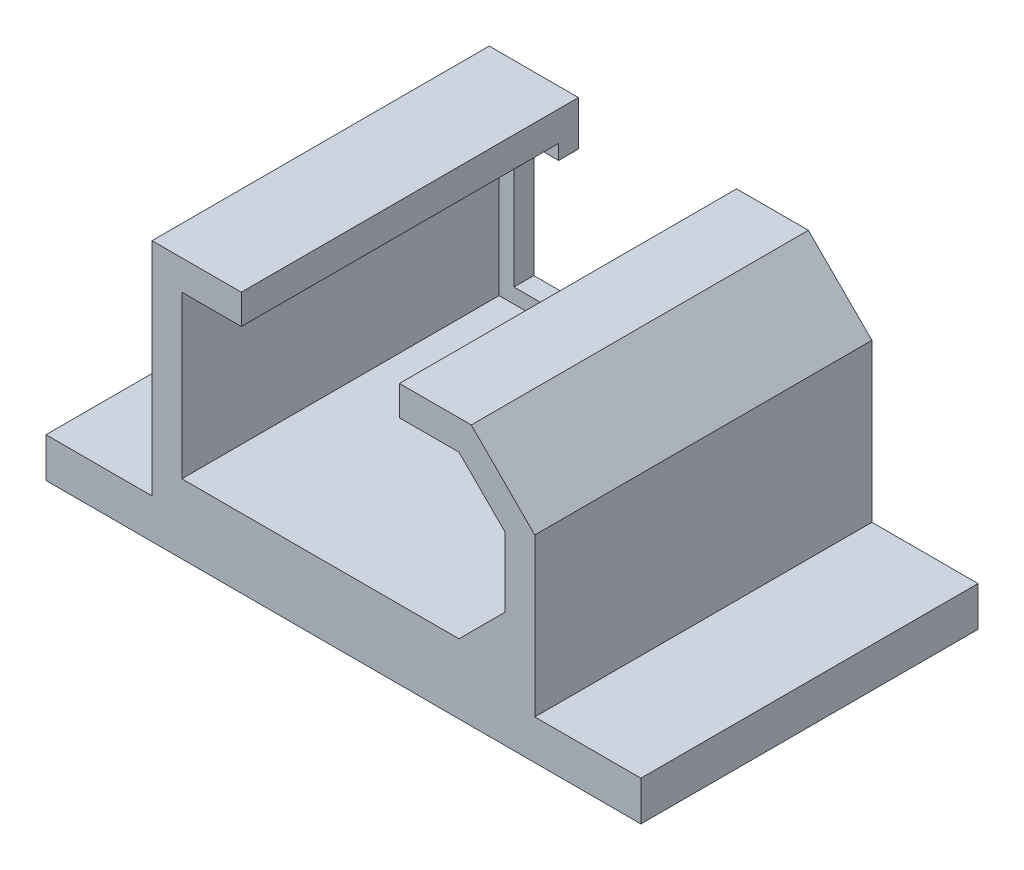
ISO-10303-21;
HEADER;
FILE_DESCRIPTION(('STEP AP214'),'2;1');
FILE_NAME('part.step','',(''),(''),'','','');
FILE_SCHEMA(('AUTOMOTIVE_DESIGN { 1 0 10303 214 1 1 1 1 }'));
ENDSEC;
DATA;
#1=APPLICATION_CONTEXT('core data for automotive mechanical design processes');
#2=APPLICATION_PROTOCOL_DEFINITION('international standard','automotive_design',2000,#1);
#3=PRODUCT_CONTEXT('',#1,'mechanical');
#4=PRODUCT('Part','Part','',(#3));
#5=PRODUCT_RELATED_PRODUCT_CATEGORY('part','',(#4));
#6=PRODUCT_DEFINITION_FORMATION('','',#4);
#7=PRODUCT_DEFINITION_CONTEXT('part definition',#1,'design');
#8=PRODUCT_DEFINITION('design','',#6,#7);
#9=PRODUCT_DEFINITION_SHAPE('','',#8);
#10=(LENGTH_UNIT() NAMED_UNIT(*) SI_UNIT(.MILLI.,.METRE.));
#11=(NAMED_UNIT(*) PLANE_ANGLE_UNIT() SI_UNIT($,.RADIAN.));
#12=(NAMED_UNIT(*) SI_UNIT($,.STERADIAN.) SOLID_ANGLE_UNIT());
#13=UNCERTAINTY_MEASURE_WITH_UNIT(LENGTH_MEASURE(1.E-05),#10,'distance_accuracy_value','');
#14=(GEOMETRIC_REPRESENTATION_CONTEXT(3) GLOBAL_UNCERTAINTY_ASSIGNED_CONTEXT((#13)) GLOBAL_UNIT_ASSIGNED_CONTEXT((#10,
#11,#12)) REPRESENTATION_CONTEXT('',''));
#15=CARTESIAN_POINT('',(0.,0.,0.));
#16=DIRECTION('',(0.,0.,1.));
#17=DIRECTION('',(1.,0.,0.));
#18=AXIS2_PLACEMENT_3D('',#15,#16,#17);
#19=CARTESIAN_POINT('',(24.65,0.,17.));
#20=DIRECTION('',(1.,0.,0.));
#21=DIRECTION('',(0.,0.,-1.));
#22=AXIS2_PLACEMENT_3D('',#19,#20,#21);
#23=PLANE('',#22);
#24=DIRECTION('',(0.,-1.,0.));
#25=VECTOR('',#24,1.);
#26=CARTESIAN_POINT('',(24.65,0.,0.));
#27=LINE('',#26,#25);
#28=CARTESIAN_POINT('',(24.65,9.94632034355964,0.));
#29=VERTEX_POINT('',#28);
#30=CARTESIAN_POINT('',(24.65,2.,0.));
#31=VERTEX_POINT('',#30);
#32=EDGE_CURVE('E177',#29,#31,#27,.T.);
#33=ORIENTED_EDGE('',*,*,#32,.F.);
#34=DIRECTION('',(0.,0.,-1.));
#35=VECTOR('',#34,1.);
#36=CARTESIAN_POINT('',(24.65,9.94632034355964,17.));
#37=LINE('',#36,#35);
#38=CARTESIAN_POINT('',(24.65,9.94632034355964,17.));
#39=VERTEX_POINT('',#38);
#40=EDGE_CURVE('E11',#39,#29,#37,.T.);
#41=ORIENTED_EDGE('',*,*,#40,.F.);
#42=DIRECTION('',(0.,-1.,0.));
#43=VECTOR('',#42,1.);
#44=CARTESIAN_POINT('',(24.65,0.,17.));
#45=LINE('',#44,#43);
#46=CARTESIAN_POINT('',(24.65,2.,17.));
#47=VERTEX_POINT('',#46);
#48=EDGE_CURVE('E208',#39,#47,#45,.T.);
#49=ORIENTED_EDGE('',*,*,#48,.T.);
#50=DIRECTION('',(0.,0.,-1.));
#51=VECTOR('',#50,1.);
#52=CARTESIAN_POINT('',(24.65,2.,17.));
#53=LINE('',#52,#51);
#54=EDGE_CURVE('E53',#47,#31,#53,.T.);
#55=ORIENTED_EDGE('',*,*,#54,.T.);
#56=EDGE_LOOP('',(#33,#41,#49,#55));
#57=FACE_BOUND('',#56,.T.);
#58=ADVANCED_FACE('F37',(#57),#23,.T.);
#59=CARTESIAN_POINT('',(17.2981601717798,17.2981601717798,17.));
#60=DIRECTION('',(-0.707106781186548,-0.707106781186547,0.));
#61=DIRECTION('',(0.707106781186547,-0.707106781186548,0.));
#62=AXIS2_PLACEMENT_3D('',#59,#60,#61);
#63=PLANE('',#62);
#64=DIRECTION('',(-0.707106781186547,0.707106781186548,0.));
#65=VECTOR('',#64,1.);
#66=CARTESIAN_POINT('',(17.2981601717798,17.2981601717798,0.));
#67=LINE('',#66,#65);
#68=CARTESIAN_POINT('',(21.4463203435596,13.15,0.));
#69=VERTEX_POINT('',#68);
#70=EDGE_CURVE('E179',#29,#69,#67,.T.);
#71=ORIENTED_EDGE('',*,*,#70,.T.);
#72=DIRECTION('',(0.,0.,-1.));
#73=VECTOR('',#72,1.);
#74=CARTESIAN_POINT('',(21.4463203435596,13.15,17.));
#75=LINE('',#74,#73);
#76=CARTESIAN_POINT('',(21.4463203435596,13.15,17.));
#77=VERTEX_POINT('',#76);
#78=EDGE_CURVE('E45',#77,#69,#75,.T.);
#79=ORIENTED_EDGE('',*,*,#78,.F.);
#80=DIRECTION('',(-0.707106781186547,0.707106781186548,0.));
#81=VECTOR('',#80,1.);
#82=CARTESIAN_POINT('',(17.2981601717798,17.2981601717798,17.));
#83=LINE('',#82,#81);
#84=EDGE_CURVE('E287',#39,#77,#83,.T.);
#85=ORIENTED_EDGE('',*,*,#84,.F.);
#86=ORIENTED_EDGE('',*,*,#40,.T.);
#87=EDGE_LOOP('',(#71,#79,#85,#86));
#88=FACE_BOUND('',#87,.T.);
#89=ADVANCED_FACE('F336',(#88),#63,.F.);
#90=CARTESIAN_POINT('',(0.,13.15,17.));
#91=DIRECTION('',(0.,-1.,0.));
#92=DIRECTION('',(0.,0.,-1.));
#93=AXIS2_PLACEMENT_3D('',#90,#91,#92);
#94=PLANE('',#93);
#95=DIRECTION('',(-1.,0.,0.));
#96=VECTOR('',#95,1.);
#97=CARTESIAN_POINT('',(0.,13.15,0.));
#98=LINE('',#97,#96);
#99=CARTESIAN_POINT('',(17.825,13.15,0.));
#100=VERTEX_POINT('',#99);
#101=EDGE_CURVE('E182',#69,#100,#98,.T.);
#102=ORIENTED_EDGE('',*,*,#101,.T.);
#103=DIRECTION('',(0.,0.,-1.));
#104=VECTOR('',#103,1.);
#105=CARTESIAN_POINT('',(17.825,13.15,17.));
#106=LINE('',#105,#104);
#107=CARTESIAN_POINT('',(17.825,13.15,17.));
#108=VERTEX_POINT('',#107);
#109=EDGE_CURVE('E244',#108,#100,#106,.T.);
#110=ORIENTED_EDGE('',*,*,#109,.F.);
#111=DIRECTION('',(-1.,0.,0.));
#112=VECTOR('',#111,1.);
#113=CARTESIAN_POINT('',(0.,13.15,17.));
#114=LINE('',#113,#112);
#115=EDGE_CURVE('E253',#77,#108,#114,.T.);
#116=ORIENTED_EDGE('',*,*,#115,.F.);
#117=ORIENTED_EDGE('',*,*,#78,.T.);
#118=EDGE_LOOP('',(#102,#110,#116,#117));
#119=FACE_BOUND('',#118,.T.);
#120=ADVANCED_FACE('F251',(#119),#94,.F.);
#121=CARTESIAN_POINT('',(17.825,0.,17.));
#122=DIRECTION('',(1.,0.,0.));
#123=DIRECTION('',(0.,0.,-1.));
#124=AXIS2_PLACEMENT_3D('',#121,#122,#123);
#125=PLANE('',#124);
#126=DIRECTION('',(0.,-1.,0.));
#127=VECTOR('',#126,1.);
#128=CARTESIAN_POINT('',(17.825,0.,0.));
#129=LINE('',#128,#127);
#130=CARTESIAN_POINT('',(17.825,10.9,0.));
#131=VERTEX_POINT('',#130);
#132=EDGE_CURVE('E184',#100,#131,#129,.T.);
#133=ORIENTED_EDGE('',*,*,#132,.T.);
#134=DIRECTION('',(0.,0.,-1.));
#135=VECTOR('',#134,1.);
#136=CARTESIAN_POINT('',(17.825,10.9,1.));
#137=LINE('',#136,#135);
#138=CARTESIAN_POINT('',(17.825,10.9,1.));
#139=VERTEX_POINT('',#138);
#140=EDGE_CURVE('E180',#139,#131,#137,.T.);
#141=ORIENTED_EDGE('',*,*,#140,.F.);
#142=DIRECTION('',(0.,-1.,0.));
#143=VECTOR('',#142,1.);
#144=CARTESIAN_POINT('',(17.825,0.,1.));
#145=LINE('',#144,#143);
#146=CARTESIAN_POINT('',(17.825,11.65,1.));
#147=VERTEX_POINT('',#146);
#148=EDGE_CURVE('E564',#147,#139,#145,.T.);
#149=ORIENTED_EDGE('',*,*,#148,.F.);
#150=DIRECTION('',(0.,0.,-1.));
#151=VECTOR('',#150,1.);
#152=CARTESIAN_POINT('',(17.825,11.65,17.));
#153=LINE('',#152,#151);
#154=CARTESIAN_POINT('',(17.825,11.65,17.));
#155=VERTEX_POINT('',#154);
#156=EDGE_CURVE('E241',#155,#147,#153,.T.);
#157=ORIENTED_EDGE('',*,*,#156,.F.);
#158=DIRECTION('',(0.,-1.,0.));
#159=VECTOR('',#158,1.);
#160=CARTESIAN_POINT('',(17.825,0.,17.));
#161=LINE('',#160,#159);
#162=EDGE_CURVE('E290',#108,#155,#161,.T.);
#163=ORIENTED_EDGE('',*,*,#162,.F.);
#164=ORIENTED_EDGE('',*,*,#109,.T.);
#165=EDGE_LOOP('',(#133,#141,#149,#157,#163,#164));
#166=FACE_BOUND('',#165,.T.);
#167=ADVANCED_FACE('F267',(#166),#125,.F.);
#168=CARTESIAN_POINT('',(0.,11.65,17.));
#169=DIRECTION('',(0.,1.,0.));
#170=DIRECTION('',(-1.,0.,0.));
#171=AXIS2_PLACEMENT_3D('',#168,#169,#170);
#172=PLANE('',#171);
#173=ORIENTED_EDGE('',*,*,#156,.T.);
#174=DIRECTION('',(1.,0.,0.));
#175=VECTOR('',#174,1.);
#176=CARTESIAN_POINT('',(0.,11.65,1.));
#177=LINE('',#176,#175);
#178=CARTESIAN_POINT('',(20.825,11.65,1.));
#179=VERTEX_POINT('',#178);
#180=EDGE_CURVE('E563',#147,#179,#177,.T.);
#181=ORIENTED_EDGE('',*,*,#180,.T.);
#182=DIRECTION('',(0.,0.,-1.));
#183=VECTOR('',#182,1.);
#184=CARTESIAN_POINT('',(20.825,11.65,17.));
#185=LINE('',#184,#183);
#186=CARTESIAN_POINT('',(20.825,11.65,17.));
#187=VERTEX_POINT('',#186);
#188=EDGE_CURVE('E238',#187,#179,#185,.T.);
#189=ORIENTED_EDGE('',*,*,#188,.F.);
#190=DIRECTION('',(1.,0.,0.));
#191=VECTOR('',#190,1.);
#192=CARTESIAN_POINT('',(0.,11.65,17.));
#193=LINE('',#192,#191);
#194=EDGE_CURVE('E292',#155,#187,#193,.T.);
#195=ORIENTED_EDGE('',*,*,#194,.F.);
#196=EDGE_LOOP('',(#173,#181,#189,#195));
#197=FACE_BOUND('',#196,.T.);
#198=ADVANCED_FACE('F347',(#197),#172,.F.);
#199=CARTESIAN_POINT('',(16.2375,16.2375,17.));
#200=DIRECTION('',(-0.707106781186548,-0.707106781186547,0.));
#201=DIRECTION('',(0.707106781186547,-0.707106781186548,0.));
#202=AXIS2_PLACEMENT_3D('',#199,#200,#201);
#203=PLANE('',#202);
#204=DIRECTION('',(-0.707106781186547,0.707106781186548,0.));
#205=VECTOR('',#204,1.);
#206=CARTESIAN_POINT('',(16.2375,16.2375,1.));
#207=LINE('',#206,#205);
#208=CARTESIAN_POINT('',(23.15,9.325,1.));
#209=VERTEX_POINT('',#208);
#210=EDGE_CURVE('E567',#209,#179,#207,.T.);
#211=ORIENTED_EDGE('',*,*,#210,.F.);
#212=DIRECTION('',(0.,0.,-1.));
#213=VECTOR('',#212,1.);
#214=CARTESIAN_POINT('',(23.15,9.325,17.));
#215=LINE('',#214,#213);
#216=CARTESIAN_POINT('',(23.15,9.325,17.));
#217=VERTEX_POINT('',#216);
#218=EDGE_CURVE('E235',#217,#209,#215,.T.);
#219=ORIENTED_EDGE('',*,*,#218,.F.);
#220=DIRECTION('',(-0.707106781186547,0.707106781186548,0.));
#221=VECTOR('',#220,1.);
#222=CARTESIAN_POINT('',(16.2375,16.2375,17.));
#223=LINE('',#222,#221);
#224=EDGE_CURVE('E294',#217,#187,#223,.T.);
#225=ORIENTED_EDGE('',*,*,#224,.T.);
#226=ORIENTED_EDGE('',*,*,#188,.T.);
#227=EDGE_LOOP('',(#211,#219,#225,#226));
#228=FACE_BOUND('',#227,.T.);
#229=ADVANCED_FACE('F350',(#228),#203,.T.);
#230=CARTESIAN_POINT('',(23.15,0.,17.));
#231=DIRECTION('',(-1.,0.,0.));
#232=DIRECTION('',(0.,0.,1.));
#233=AXIS2_PLACEMENT_3D('',#230,#231,#232);
#234=PLANE('',#233);
#235=DIRECTION('',(0.,1.,0.));
#236=VECTOR('',#235,1.);
#237=CARTESIAN_POINT('',(23.15,0.,1.));
#238=LINE('',#237,#236);
#239=CARTESIAN_POINT('',(23.15,5.825,1.));
#240=VERTEX_POINT('',#239);
#241=EDGE_CURVE('E610',#240,#209,#238,.T.);
#242=ORIENTED_EDGE('',*,*,#241,.F.);
#243=DIRECTION('',(0.,0.,-1.));
#244=VECTOR('',#243,1.);
#245=CARTESIAN_POINT('',(23.15,5.825,17.));
#246=LINE('',#245,#244);
#247=CARTESIAN_POINT('',(23.15,5.825,17.));
#248=VERTEX_POINT('',#247);
#249=EDGE_CURVE('E232',#248,#240,#246,.T.);
#250=ORIENTED_EDGE('',*,*,#249,.F.);
#251=DIRECTION('',(0.,1.,0.));
#252=VECTOR('',#251,1.);
#253=CARTESIAN_POINT('',(23.15,0.,17.));
#254=LINE('',#253,#252);
#255=EDGE_CURVE('E297',#248,#217,#254,.T.);
#256=ORIENTED_EDGE('',*,*,#255,.T.);
#257=ORIENTED_EDGE('',*,*,#218,.T.);
#258=EDGE_LOOP('',(#242,#250,#256,#257));
#259=FACE_BOUND('',#258,.T.);
#260=ADVANCED_FACE('F354',(#259),#234,.T.);
#261=CARTESIAN_POINT('',(8.66250000000004,-8.66250000000001,17.));
#262=DIRECTION('',(-0.707106781186549,0.707106781186546,0.));
#263=DIRECTION('',(-0.707106781186546,-0.707106781186549,0.));
#264=AXIS2_PLACEMENT_3D('',#261,#262,#263);
#265=PLANE('',#264);
#266=DIRECTION('',(0.707106781186546,0.707106781186549,0.));
#267=VECTOR('',#266,1.);
#268=CARTESIAN_POINT('',(8.66250000000004,-8.66250000000001,1.));
#269=LINE('',#268,#267);
#270=CARTESIAN_POINT('',(20.825,3.5,1.));
#271=VERTEX_POINT('',#270);
#272=EDGE_CURVE('E607',#271,#240,#269,.T.);
#273=ORIENTED_EDGE('',*,*,#272,.F.);
#274=DIRECTION('',(0.,0.,-1.));
#275=VECTOR('',#274,1.);
#276=CARTESIAN_POINT('',(20.825,3.5,17.));
#277=LINE('',#276,#275);
#278=CARTESIAN_POINT('',(20.825,3.5,17.));
#279=VERTEX_POINT('',#278);
#280=EDGE_CURVE('E229',#279,#271,#277,.T.);
#281=ORIENTED_EDGE('',*,*,#280,.F.);
#282=DIRECTION('',(0.707106781186546,0.707106781186549,0.));
#283=VECTOR('',#282,1.);
#284=CARTESIAN_POINT('',(8.66250000000004,-8.66250000000001,17.));
#285=LINE('',#284,#283);
#286=EDGE_CURVE('E300',#279,#248,#285,.T.);
#287=ORIENTED_EDGE('',*,*,#286,.T.);
#288=ORIENTED_EDGE('',*,*,#249,.T.);
#289=EDGE_LOOP('',(#273,#281,#287,#288));
#290=FACE_BOUND('',#289,.T.);
#291=ADVANCED_FACE('F358',(#290),#265,.T.);
#292=CARTESIAN_POINT('',(0.,3.5,17.));
#293=DIRECTION('',(0.,1.,0.));
#294=DIRECTION('',(-1.,0.,0.));
#295=AXIS2_PLACEMENT_3D('',#292,#293,#294);
#296=PLANE('',#295);
#297=DIRECTION('',(1.,0.,0.));
#298=VECTOR('',#297,1.);
#299=CARTESIAN_POINT('',(0.,3.5,1.));
#300=LINE('',#299,#298);
#301=CARTESIAN_POINT('',(6.85,3.5,1.));
#302=VERTEX_POINT('',#301);
#303=EDGE_CURVE('E604',#302,#271,#300,.T.);
#304=ORIENTED_EDGE('',*,*,#303,.F.);
#305=DIRECTION('',(0.,0.,-1.));
#306=VECTOR('',#305,1.);
#307=CARTESIAN_POINT('',(6.85,3.5,17.));
#308=LINE('',#307,#306);
#309=CARTESIAN_POINT('',(6.85,3.5,17.));
#310=VERTEX_POINT('',#309);
#311=EDGE_CURVE('E226',#310,#302,#308,.T.);
#312=ORIENTED_EDGE('',*,*,#311,.F.);
#313=DIRECTION('',(1.,0.,0.));
#314=VECTOR('',#313,1.);
#315=CARTESIAN_POINT('',(0.,3.5,17.));
#316=LINE('',#315,#314);
#317=EDGE_CURVE('E303',#310,#279,#316,.T.);
#318=ORIENTED_EDGE('',*,*,#317,.T.);
#319=ORIENTED_EDGE('',*,*,#280,.T.);
#320=EDGE_LOOP('',(#304,#312,#318,#319));
#321=FACE_BOUND('',#320,.T.);
#322=ADVANCED_FACE('F362',(#321),#296,.T.);
#323=CARTESIAN_POINT('',(6.85,0.,17.));
#324=DIRECTION('',(1.,0.,0.));
#325=DIRECTION('',(0.,0.,-1.));
#326=AXIS2_PLACEMENT_3D('',#323,#324,#325);
#327=PLANE('',#326);
#328=DIRECTION('',(0.,-1.,0.));
#329=VECTOR('',#328,1.);
#330=CARTESIAN_POINT('',(6.85,0.,1.));
#331=LINE('',#330,#329);
#332=CARTESIAN_POINT('',(6.85,11.65,1.));
#333=VERTEX_POINT('',#332);
#334=EDGE_CURVE('E601',#333,#302,#331,.T.);
#335=ORIENTED_EDGE('',*,*,#334,.F.);
#336=DIRECTION('',(0.,0.,-1.));
#337=VECTOR('',#336,1.);
#338=CARTESIAN_POINT('',(6.85,11.65,17.));
#339=LINE('',#338,#337);
#340=CARTESIAN_POINT('',(6.85,11.65,17.));
#341=VERTEX_POINT('',#340);
#342=EDGE_CURVE('E223',#341,#333,#339,.T.);
#343=ORIENTED_EDGE('',*,*,#342,.F.);
#344=DIRECTION('',(0.,-1.,0.));
#345=VECTOR('',#344,1.);
#346=CARTESIAN_POINT('',(6.85,0.,17.));
#347=LINE('',#346,#345);
#348=EDGE_CURVE('E306',#341,#310,#347,.T.);
#349=ORIENTED_EDGE('',*,*,#348,.T.);
#350=ORIENTED_EDGE('',*,*,#311,.T.);
#351=EDGE_LOOP('',(#335,#343,#349,#350));
#352=FACE_BOUND('',#351,.T.);
#353=ADVANCED_FACE('F366',(#352),#327,.T.);
#354=CARTESIAN_POINT('',(0.,11.65,17.));
#355=DIRECTION('',(0.,1.,0.));
#356=DIRECTION('',(0.,0.,1.));
#357=AXIS2_PLACEMENT_3D('',#354,#355,#356);
#358=PLANE('',#357);
#359=ORIENTED_EDGE('',*,*,#342,.T.);
#360=DIRECTION('',(1.,0.,0.));
#361=VECTOR('',#360,1.);
#362=CARTESIAN_POINT('',(0.,11.65,1.));
#363=LINE('',#362,#361);
#364=CARTESIAN_POINT('',(9.85,11.65,1.));
#365=VERTEX_POINT('',#364);
#366=EDGE_CURVE('E598',#333,#365,#363,.T.);
#367=ORIENTED_EDGE('',*,*,#366,.T.);
#368=DIRECTION('',(0.,0.,-1.));
#369=VECTOR('',#368,1.);
#370=CARTESIAN_POINT('',(9.85,11.65,17.));
#371=LINE('',#370,#369);
#372=CARTESIAN_POINT('',(9.85,11.65,17.));
#373=VERTEX_POINT('',#372);
#374=EDGE_CURVE('E220',#373,#365,#371,.T.);
#375=ORIENTED_EDGE('',*,*,#374,.F.);
#376=DIRECTION('',(1.,0.,0.));
#377=VECTOR('',#376,1.);
#378=CARTESIAN_POINT('',(0.,11.65,17.));
#379=LINE('',#378,#377);
#380=EDGE_CURVE('E309',#341,#373,#379,.T.);
#381=ORIENTED_EDGE('',*,*,#380,.F.);
#382=EDGE_LOOP('',(#359,#367,#375,#381));
#383=FACE_BOUND('',#382,.T.);
#384=ADVANCED_FACE('F370',(#383),#358,.F.);
#385=CARTESIAN_POINT('',(9.85,0.,17.));
#386=DIRECTION('',(1.,0.,0.));
#387=DIRECTION('',(0.,0.,-1.));
#388=AXIS2_PLACEMENT_3D('',#385,#386,#387);
#389=PLANE('',#388);
#390=DIRECTION('',(0.,-1.,0.));
#391=VECTOR('',#390,1.);
#392=CARTESIAN_POINT('',(9.85,0.,0.));
#393=LINE('',#392,#391);
#394=CARTESIAN_POINT('',(9.85,13.15,0.));
#395=VERTEX_POINT('',#394);
#396=CARTESIAN_POINT('',(9.85,10.9,0.));
#397=VERTEX_POINT('',#396);
#398=EDGE_CURVE('E187',#395,#397,#393,.T.);
#399=ORIENTED_EDGE('',*,*,#398,.F.);
#400=DIRECTION('',(0.,0.,-1.));
#401=VECTOR('',#400,1.);
#402=CARTESIAN_POINT('',(9.85,13.15,17.));
#403=LINE('',#402,#401);
#404=CARTESIAN_POINT('',(9.85,13.15,17.));
#405=VERTEX_POINT('',#404);
#406=EDGE_CURVE('E218',#405,#395,#403,.T.);
#407=ORIENTED_EDGE('',*,*,#406,.F.);
#408=DIRECTION('',(0.,-1.,0.));
#409=VECTOR('',#408,1.);
#410=CARTESIAN_POINT('',(9.85,0.,17.));
#411=LINE('',#410,#409);
#412=EDGE_CURVE('E311',#405,#373,#411,.T.);
#413=ORIENTED_EDGE('',*,*,#412,.T.);
#414=ORIENTED_EDGE('',*,*,#374,.T.);
#415=DIRECTION('',(0.,-1.,0.));
#416=VECTOR('',#415,1.);
#417=CARTESIAN_POINT('',(9.85,0.,1.));
#418=LINE('',#417,#416);
#419=CARTESIAN_POINT('',(9.85,10.9,1.));
#420=VERTEX_POINT('',#419);
#421=EDGE_CURVE('E595',#365,#420,#418,.T.);
#422=ORIENTED_EDGE('',*,*,#421,.T.);
#423=DIRECTION('',(0.,0.,-1.));
#424=VECTOR('',#423,1.);
#425=CARTESIAN_POINT('',(9.85,10.9,1.));
#426=LINE('',#425,#424);
#427=EDGE_CURVE('E613',#420,#397,#426,.T.);
#428=ORIENTED_EDGE('',*,*,#427,.T.);
#429=EDGE_LOOP('',(#399,#407,#413,#414,#422,#428));
#430=FACE_BOUND('',#429,.T.);
#431=ADVANCED_FACE('F374',(#430),#389,.T.);
#432=CARTESIAN_POINT('',(0.,13.15,17.));
#433=DIRECTION('',(0.,1.,0.));
#434=DIRECTION('',(0.,0.,1.));
#435=AXIS2_PLACEMENT_3D('',#432,#433,#434);
#436=PLANE('',#435);
#437=DIRECTION('',(1.,0.,0.));
#438=VECTOR('',#437,1.);
#439=CARTESIAN_POINT('',(0.,13.15,0.));
#440=LINE('',#439,#438);
#441=CARTESIAN_POINT('',(5.35,13.15,0.));
#442=VERTEX_POINT('',#441);
#443=EDGE_CURVE('E190',#442,#395,#440,.T.);
#444=ORIENTED_EDGE('',*,*,#443,.F.);
#445=DIRECTION('',(0.,0.,-1.));
#446=VECTOR('',#445,1.);
#447=CARTESIAN_POINT('',(5.35,13.15,17.));
#448=LINE('',#447,#446);
#449=CARTESIAN_POINT('',(5.35,13.15,17.));
#450=VERTEX_POINT('',#449);
#451=EDGE_CURVE('E216',#450,#442,#448,.T.);
#452=ORIENTED_EDGE('',*,*,#451,.F.);
#453=DIRECTION('',(1.,0.,0.));
#454=VECTOR('',#453,1.);
#455=CARTESIAN_POINT('',(0.,13.15,17.));
#456=LINE('',#455,#454);
#457=EDGE_CURVE('E314',#450,#405,#456,.T.);
#458=ORIENTED_EDGE('',*,*,#457,.T.);
#459=ORIENTED_EDGE('',*,*,#406,.T.);
#460=EDGE_LOOP('',(#444,#452,#458,#459));
#461=FACE_BOUND('',#460,.T.);
#462=ADVANCED_FACE('F378',(#461),#436,.T.);
#463=CARTESIAN_POINT('',(5.35,0.,17.));
#464=DIRECTION('',(1.,0.,0.));
#465=DIRECTION('',(0.,0.,-1.));
#466=AXIS2_PLACEMENT_3D('',#463,#464,#465);
#467=PLANE('',#466);
#468=DIRECTION('',(0.,-1.,0.));
#469=VECTOR('',#468,1.);
#470=CARTESIAN_POINT('',(5.35,0.,0.));
#471=LINE('',#470,#469);
#472=CARTESIAN_POINT('',(5.35,2.,0.));
#473=VERTEX_POINT('',#472);
#474=EDGE_CURVE('E193',#442,#473,#471,.T.);
#475=ORIENTED_EDGE('',*,*,#474,.T.);
#476=DIRECTION('',(0.,0.,-1.));
#477=VECTOR('',#476,1.);
#478=CARTESIAN_POINT('',(5.35,2.,17.));
#479=LINE('',#478,#477);
#480=CARTESIAN_POINT('',(5.35,2.,17.));
#481=VERTEX_POINT('',#480);
#482=EDGE_CURVE('E214',#481,#473,#479,.T.);
#483=ORIENTED_EDGE('',*,*,#482,.F.);
#484=DIRECTION('',(0.,-1.,0.));
#485=VECTOR('',#484,1.);
#486=CARTESIAN_POINT('',(5.35,0.,17.));
#487=LINE('',#486,#485);
#488=EDGE_CURVE('E317',#450,#481,#487,.T.);
#489=ORIENTED_EDGE('',*,*,#488,.F.);
#490=ORIENTED_EDGE('',*,*,#451,.T.);
#491=EDGE_LOOP('',(#475,#483,#489,#490));
#492=FACE_BOUND('',#491,.T.);
#493=ADVANCED_FACE('F382',(#492),#467,.F.);
#494=CARTESIAN_POINT('',(0.,2.,17.));
#495=DIRECTION('',(0.,1.,0.));
#496=DIRECTION('',(-1.,0.,0.));
#497=AXIS2_PLACEMENT_3D('',#494,#495,#496);
#498=PLANE('',#497);
#499=DIRECTION('',(1.,0.,0.));
#500=VECTOR('',#499,1.);
#501=CARTESIAN_POINT('',(0.,2.,0.));
#502=LINE('',#501,#500);
#503=CARTESIAN_POINT('',(0.,2.,0.));
#504=VERTEX_POINT('',#503);
#505=EDGE_CURVE('E196',#504,#473,#502,.T.);
#506=ORIENTED_EDGE('',*,*,#505,.F.);
#507=DIRECTION('',(0.,0.,-1.));
#508=VECTOR('',#507,1.);
#509=CARTESIAN_POINT('',(0.,2.,17.));
#510=LINE('',#509,#508);
#511=CARTESIAN_POINT('',(0.,2.,17.));
#512=VERTEX_POINT('',#511);
#513=EDGE_CURVE('E212',#512,#504,#510,.T.);
#514=ORIENTED_EDGE('',*,*,#513,.F.);
#515=DIRECTION('',(1.,0.,0.));
#516=VECTOR('',#515,1.);
#517=CARTESIAN_POINT('',(0.,2.,17.));
#518=LINE('',#517,#516);
#519=EDGE_CURVE('E319',#512,#481,#518,.T.);
#520=ORIENTED_EDGE('',*,*,#519,.T.);
#521=ORIENTED_EDGE('',*,*,#482,.T.);
#522=EDGE_LOOP('',(#506,#514,#520,#521));
#523=FACE_BOUND('',#522,.T.);
#524=ADVANCED_FACE('F386',(#523),#498,.T.);
#525=CARTESIAN_POINT('',(0.,0.,17.));
#526=DIRECTION('',(-1.,0.,0.));
#527=DIRECTION('',(0.,0.,1.));
#528=AXIS2_PLACEMENT_3D('',#525,#526,#527);
#529=PLANE('',#528);
#530=DIRECTION('',(0.,1.,0.));
#531=VECTOR('',#530,1.);
#532=CARTESIAN_POINT('',(0.,0.,0.));
#533=LINE('',#532,#531);
#534=CARTESIAN_POINT('',(0.,0.,0.));
#535=VERTEX_POINT('',#534);
#536=EDGE_CURVE('E199',#535,#504,#533,.T.);
#537=ORIENTED_EDGE('',*,*,#536,.F.);
#538=DIRECTION('',(0.,0.,-1.));
#539=VECTOR('',#538,1.);
#540=CARTESIAN_POINT('',(0.,0.,17.));
#541=LINE('',#540,#539);
#542=CARTESIAN_POINT('',(0.,0.,17.));
#543=VERTEX_POINT('',#542);
#544=EDGE_CURVE('E158',#543,#535,#541,.T.);
#545=ORIENTED_EDGE('',*,*,#544,.F.);
#546=DIRECTION('',(0.,1.,0.));
#547=VECTOR('',#546,1.);
#548=CARTESIAN_POINT('',(0.,0.,17.));
#549=LINE('',#548,#547);
#550=EDGE_CURVE('E169',#543,#512,#549,.T.);
#551=ORIENTED_EDGE('',*,*,#550,.T.);
#552=ORIENTED_EDGE('',*,*,#513,.T.);
#553=EDGE_LOOP('',(#537,#545,#551,#552));
#554=FACE_BOUND('',#553,.T.);
#555=ADVANCED_FACE('F323',(#554),#529,.T.);
#556=CARTESIAN_POINT('',(0.,0.,17.));
#557=DIRECTION('',(0.,-1.,0.));
#558=DIRECTION('',(0.,0.,-1.));
#559=AXIS2_PLACEMENT_3D('',#556,#557,#558);
#560=PLANE('',#559);
#561=DIRECTION('',(-1.,0.,0.));
#562=VECTOR('',#561,1.);
#563=CARTESIAN_POINT('',(0.,0.,0.));
#564=LINE('',#563,#562);
#565=CARTESIAN_POINT('',(30.,0.,0.));
#566=VERTEX_POINT('',#565);
#567=EDGE_CURVE('E154',#566,#535,#564,.T.);
#568=ORIENTED_EDGE('',*,*,#567,.F.);
#569=DIRECTION('',(0.,0.,-1.));
#570=VECTOR('',#569,1.);
#571=CARTESIAN_POINT('',(30.,0.,17.));
#572=LINE('',#571,#570);
#573=CARTESIAN_POINT('',(30.,0.,17.));
#574=VERTEX_POINT('',#573);
#575=EDGE_CURVE('E149',#574,#566,#572,.T.);
#576=ORIENTED_EDGE('',*,*,#575,.F.);
#577=DIRECTION('',(-1.,0.,0.));
#578=VECTOR('',#577,1.);
#579=CARTESIAN_POINT('',(0.,0.,17.));
#580=LINE('',#579,#578);
#581=EDGE_CURVE('E152',#574,#543,#580,.T.);
#582=ORIENTED_EDGE('',*,*,#581,.T.);
#583=ORIENTED_EDGE('',*,*,#544,.T.);
#584=EDGE_LOOP('',(#568,#576,#582,#583));
#585=FACE_BOUND('',#584,.T.);
#586=ADVANCED_FACE('F151',(#585),#560,.T.);
#587=CARTESIAN_POINT('',(30.,0.,17.));
#588=DIRECTION('',(1.,0.,0.));
#589=DIRECTION('',(0.,0.,-1.));
#590=AXIS2_PLACEMENT_3D('',#587,#588,#589);
#591=PLANE('',#590);
#592=DIRECTION('',(0.,-1.,0.));
#593=VECTOR('',#592,1.);
#594=CARTESIAN_POINT('',(30.,0.,0.));
#595=LINE('',#594,#593);
#596=CARTESIAN_POINT('',(30.,2.,0.));
#597=VERTEX_POINT('',#596);
#598=EDGE_CURVE('E203',#597,#566,#595,.T.);
#599=ORIENTED_EDGE('',*,*,#598,.F.);
#600=DIRECTION('',(0.,0.,-1.));
#601=VECTOR('',#600,1.);
#602=CARTESIAN_POINT('',(30.,2.,17.));
#603=LINE('',#602,#601);
#604=CARTESIAN_POINT('',(30.,2.,17.));
#605=VERTEX_POINT('',#604);
#606=EDGE_CURVE('E88',#605,#597,#603,.T.);
#607=ORIENTED_EDGE('',*,*,#606,.F.);
#608=DIRECTION('',(0.,-1.,0.));
#609=VECTOR('',#608,1.);
#610=CARTESIAN_POINT('',(30.,0.,17.));
#611=LINE('',#610,#609);
#612=EDGE_CURVE('E166',#605,#574,#611,.T.);
#613=ORIENTED_EDGE('',*,*,#612,.T.);
#614=ORIENTED_EDGE('',*,*,#575,.T.);
#615=EDGE_LOOP('',(#599,#607,#613,#614));
#616=FACE_BOUND('',#615,.T.);
#617=ADVANCED_FACE('F171',(#616),#591,.T.);
#618=CARTESIAN_POINT('',(0.,2.,17.));
#619=DIRECTION('',(0.,1.,0.));
#620=DIRECTION('',(0.,0.,1.));
#621=AXIS2_PLACEMENT_3D('',#618,#619,#620);
#622=PLANE('',#621);
#623=DIRECTION('',(1.,0.,0.));
#624=VECTOR('',#623,1.);
#625=CARTESIAN_POINT('',(0.,2.,0.));
#626=LINE('',#625,#624);
#627=EDGE_CURVE('E205',#31,#597,#626,.T.);
#628=ORIENTED_EDGE('',*,*,#627,.F.);
#629=ORIENTED_EDGE('',*,*,#54,.F.);
#630=DIRECTION('',(1.,0.,0.));
#631=VECTOR('',#630,1.);
#632=CARTESIAN_POINT('',(0.,2.,17.));
#633=LINE('',#632,#631);
#634=EDGE_CURVE('E172',#47,#605,#633,.T.);
#635=ORIENTED_EDGE('',*,*,#634,.T.);
#636=ORIENTED_EDGE('',*,*,#606,.T.);
#637=EDGE_LOOP('',(#628,#629,#635,#636));
#638=FACE_BOUND('',#637,.T.);
#639=ADVANCED_FACE('F325',(#638),#622,.T.);
#640=CARTESIAN_POINT('',(0.,0.,17.));
#641=DIRECTION('',(0.,0.,1.));
#642=DIRECTION('',(1.,0.,0.));
#643=AXIS2_PLACEMENT_3D('',#640,#641,#642);
#644=PLANE('',#643);
#645=ORIENTED_EDGE('',*,*,#48,.F.);
#646=ORIENTED_EDGE('',*,*,#84,.T.);
#647=ORIENTED_EDGE('',*,*,#115,.T.);
#648=ORIENTED_EDGE('',*,*,#162,.T.);
#649=ORIENTED_EDGE('',*,*,#194,.T.);
#650=ORIENTED_EDGE('',*,*,#224,.F.);
#651=ORIENTED_EDGE('',*,*,#255,.F.);
#652=ORIENTED_EDGE('',*,*,#286,.F.);
#653=ORIENTED_EDGE('',*,*,#317,.F.);
#654=ORIENTED_EDGE('',*,*,#348,.F.);
#655=ORIENTED_EDGE('',*,*,#380,.T.);
#656=ORIENTED_EDGE('',*,*,#412,.F.);
#657=ORIENTED_EDGE('',*,*,#457,.F.);
#658=ORIENTED_EDGE('',*,*,#488,.T.);
#659=ORIENTED_EDGE('',*,*,#519,.F.);
#660=ORIENTED_EDGE('',*,*,#550,.F.);
#661=ORIENTED_EDGE('',*,*,#581,.F.);
#662=ORIENTED_EDGE('',*,*,#612,.F.);
#663=ORIENTED_EDGE('',*,*,#634,.F.);
#664=EDGE_LOOP('',(#645,#646,#647,#648,#649,#650,#651,#652,#653,#654,#655,#656,#657,#658,#659,
#660,#661,#662,#663));
#665=FACE_BOUND('',#664,.T.);
#666=ADVANCED_FACE('F164',(#665),#644,.T.);
#667=CARTESIAN_POINT('',(0.,0.,0.));
#668=DIRECTION('',(0.,0.,1.));
#669=DIRECTION('',(1.,0.,0.));
#670=AXIS2_PLACEMENT_3D('',#667,#668,#669);
#671=PLANE('',#670);
#672=ORIENTED_EDGE('',*,*,#398,.T.);
#673=DIRECTION('',(1.,0.,0.));
#674=VECTOR('',#673,1.);
#675=CARTESIAN_POINT('',(0.,10.9,0.));
#676=LINE('',#675,#674);
#677=CARTESIAN_POINT('',(7.6,10.9,0.));
#678=VERTEX_POINT('',#677);
#679=EDGE_CURVE('E570',#678,#397,#676,.T.);
#680=ORIENTED_EDGE('',*,*,#679,.F.);
#681=DIRECTION('',(0.,-1.,0.));
#682=VECTOR('',#681,1.);
#683=CARTESIAN_POINT('',(7.6,0.,0.));
#684=LINE('',#683,#682);
#685=CARTESIAN_POINT('',(7.6,4.25,0.));
#686=VERTEX_POINT('',#685);
#687=EDGE_CURVE('E626',#678,#686,#684,.T.);
#688=ORIENTED_EDGE('',*,*,#687,.T.);
#689=DIRECTION('',(1.,0.,0.));
#690=VECTOR('',#689,1.);
#691=CARTESIAN_POINT('',(0.,4.25,0.));
#692=LINE('',#691,#690);
#693=CARTESIAN_POINT('',(20.5143398282202,4.25,0.));
#694=VERTEX_POINT('',#693);
#695=EDGE_CURVE('E623',#686,#694,#692,.T.);
#696=ORIENTED_EDGE('',*,*,#695,.T.);
#697=DIRECTION('',(0.707106781186546,0.707106781186549,0.));
#698=VECTOR('',#697,1.);
#699=CARTESIAN_POINT('',(8.13216991411014,-8.1321699141101,0.));
#700=LINE('',#699,#698);
#701=CARTESIAN_POINT('',(22.4,6.13566017177982,0.));
#702=VERTEX_POINT('',#701);
#703=EDGE_CURVE('E620',#694,#702,#700,.T.);
#704=ORIENTED_EDGE('',*,*,#703,.T.);
#705=DIRECTION('',(0.,1.,0.));
#706=VECTOR('',#705,1.);
#707=CARTESIAN_POINT('',(22.4,0.,0.));
#708=LINE('',#707,#706);
#709=CARTESIAN_POINT('',(22.4,9.01433982822018,0.));
#710=VERTEX_POINT('',#709);
#711=EDGE_CURVE('E617',#702,#710,#708,.T.);
#712=ORIENTED_EDGE('',*,*,#711,.T.);
#713=DIRECTION('',(-0.707106781186547,0.707106781186548,0.));
#714=VECTOR('',#713,1.);
#715=CARTESIAN_POINT('',(15.7071699141101,15.7071699141101,0.));
#716=LINE('',#715,#714);
#717=CARTESIAN_POINT('',(20.5143398282202,10.9,0.));
#718=VERTEX_POINT('',#717);
#719=EDGE_CURVE('E615',#710,#718,#716,.T.);
#720=ORIENTED_EDGE('',*,*,#719,.T.);
#721=DIRECTION('',(1.,0.,0.));
#722=VECTOR('',#721,1.);
#723=CARTESIAN_POINT('',(0.,10.9,0.));
#724=LINE('',#723,#722);
#725=EDGE_CURVE('E263',#131,#718,#724,.T.);
#726=ORIENTED_EDGE('',*,*,#725,.F.);
#727=ORIENTED_EDGE('',*,*,#132,.F.);
#728=ORIENTED_EDGE('',*,*,#101,.F.);
#729=ORIENTED_EDGE('',*,*,#70,.F.);
#730=ORIENTED_EDGE('',*,*,#32,.T.);
#731=ORIENTED_EDGE('',*,*,#627,.T.);
#732=ORIENTED_EDGE('',*,*,#598,.T.);
#733=ORIENTED_EDGE('',*,*,#567,.T.);
#734=ORIENTED_EDGE('',*,*,#536,.T.);
#735=ORIENTED_EDGE('',*,*,#505,.T.);
#736=ORIENTED_EDGE('',*,*,#474,.F.);
#737=ORIENTED_EDGE('',*,*,#443,.T.);
#738=EDGE_LOOP('',(#672,#680,#688,#696,#704,#712,#720,#726,#727,#728,#729,#730,#731,#732,#733,
#734,#735,#736,#737));
#739=FACE_BOUND('',#738,.T.);
#740=ADVANCED_FACE('F258',(#739),#671,.F.);
#741=CARTESIAN_POINT('',(0.,10.9,1.));
#742=DIRECTION('',(0.,1.,0.));
#743=DIRECTION('',(0.,0.,1.));
#744=AXIS2_PLACEMENT_3D('',#741,#742,#743);
#745=PLANE('',#744);
#746=ORIENTED_EDGE('',*,*,#725,.T.);
#747=DIRECTION('',(0.,0.,-1.));
#748=VECTOR('',#747,1.);
#749=CARTESIAN_POINT('',(20.5143398282202,10.9,1.));
#750=LINE('',#749,#748);
#751=CARTESIAN_POINT('',(20.5143398282202,10.9,1.));
#752=VERTEX_POINT('',#751);
#753=EDGE_CURVE('E279',#752,#718,#750,.T.);
#754=ORIENTED_EDGE('',*,*,#753,.F.);
#755=DIRECTION('',(1.,0.,0.));
#756=VECTOR('',#755,1.);
#757=CARTESIAN_POINT('',(0.,10.9,1.));
#758=LINE('',#757,#756);
#759=EDGE_CURVE('E278',#139,#752,#758,.T.);
#760=ORIENTED_EDGE('',*,*,#759,.F.);
#761=ORIENTED_EDGE('',*,*,#140,.T.);
#762=EDGE_LOOP('',(#746,#754,#760,#761));
#763=FACE_BOUND('',#762,.T.);
#764=ADVANCED_FACE('F275',(#763),#745,.F.);
#765=CARTESIAN_POINT('',(15.7071699141101,15.7071699141101,1.));
#766=DIRECTION('',(-0.707106781186548,-0.707106781186547,0.));
#767=DIRECTION('',(0.707106781186547,-0.707106781186548,0.));
#768=AXIS2_PLACEMENT_3D('',#765,#766,#767);
#769=PLANE('',#768);
#770=ORIENTED_EDGE('',*,*,#719,.F.);
#771=DIRECTION('',(0.,0.,-1.));
#772=VECTOR('',#771,1.);
#773=CARTESIAN_POINT('',(22.4,9.01433982822018,1.));
#774=LINE('',#773,#772);
#775=CARTESIAN_POINT('',(22.4,9.01433982822018,1.));
#776=VERTEX_POINT('',#775);
#777=EDGE_CURVE('E282',#776,#710,#774,.T.);
#778=ORIENTED_EDGE('',*,*,#777,.F.);
#779=DIRECTION('',(-0.707106781186547,0.707106781186548,0.));
#780=VECTOR('',#779,1.);
#781=CARTESIAN_POINT('',(15.7071699141101,15.7071699141101,1.));
#782=LINE('',#781,#780);
#783=EDGE_CURVE('E575',#776,#752,#782,.T.);
#784=ORIENTED_EDGE('',*,*,#783,.T.);
#785=ORIENTED_EDGE('',*,*,#753,.T.);
#786=EDGE_LOOP('',(#770,#778,#784,#785));
#787=FACE_BOUND('',#786,.T.);
#788=ADVANCED_FACE('F485',(#787),#769,.T.);
#789=CARTESIAN_POINT('',(22.4,0.,1.));
#790=DIRECTION('',(-1.,0.,0.));
#791=DIRECTION('',(0.,0.,1.));
#792=AXIS2_PLACEMENT_3D('',#789,#790,#791);
#793=PLANE('',#792);
#794=ORIENTED_EDGE('',*,*,#711,.F.);
#795=DIRECTION('',(0.,0.,-1.));
#796=VECTOR('',#795,1.);
#797=CARTESIAN_POINT('',(22.4,6.13566017177982,1.));
#798=LINE('',#797,#796);
#799=CARTESIAN_POINT('',(22.4,6.13566017177982,1.));
#800=VERTEX_POINT('',#799);
#801=EDGE_CURVE('E642',#800,#702,#798,.T.);
#802=ORIENTED_EDGE('',*,*,#801,.F.);
#803=DIRECTION('',(0.,1.,0.));
#804=VECTOR('',#803,1.);
#805=CARTESIAN_POINT('',(22.4,0.,1.));
#806=LINE('',#805,#804);
#807=EDGE_CURVE('E580',#800,#776,#806,.T.);
#808=ORIENTED_EDGE('',*,*,#807,.T.);
#809=ORIENTED_EDGE('',*,*,#777,.T.);
#810=EDGE_LOOP('',(#794,#802,#808,#809));
#811=FACE_BOUND('',#810,.T.);
#812=ADVANCED_FACE('F494',(#811),#793,.T.);
#813=CARTESIAN_POINT('',(8.13216991411014,-8.1321699141101,1.));
#814=DIRECTION('',(-0.707106781186549,0.707106781186546,0.));
#815=DIRECTION('',(-0.707106781186546,-0.707106781186549,0.));
#816=AXIS2_PLACEMENT_3D('',#813,#814,#815);
#817=PLANE('',#816);
#818=ORIENTED_EDGE('',*,*,#703,.F.);
#819=DIRECTION('',(0.,0.,-1.));
#820=VECTOR('',#819,1.);
#821=CARTESIAN_POINT('',(20.5143398282202,4.25,1.));
#822=LINE('',#821,#820);
#823=CARTESIAN_POINT('',(20.5143398282202,4.25,1.));
#824=VERTEX_POINT('',#823);
#825=EDGE_CURVE('E639',#824,#694,#822,.T.);
#826=ORIENTED_EDGE('',*,*,#825,.F.);
#827=DIRECTION('',(0.707106781186546,0.707106781186549,0.));
#828=VECTOR('',#827,1.);
#829=CARTESIAN_POINT('',(8.13216991411014,-8.1321699141101,1.));
#830=LINE('',#829,#828);
#831=EDGE_CURVE('E583',#824,#800,#830,.T.);
#832=ORIENTED_EDGE('',*,*,#831,.T.);
#833=ORIENTED_EDGE('',*,*,#801,.T.);
#834=EDGE_LOOP('',(#818,#826,#832,#833));
#835=FACE_BOUND('',#834,.T.);
#836=ADVANCED_FACE('F504',(#835),#817,.T.);
#837=CARTESIAN_POINT('',(0.,4.25,1.));
#838=DIRECTION('',(0.,1.,0.));
#839=DIRECTION('',(-1.,0.,0.));
#840=AXIS2_PLACEMENT_3D('',#837,#838,#839);
#841=PLANE('',#840);
#842=ORIENTED_EDGE('',*,*,#695,.F.);
#843=DIRECTION('',(0.,0.,-1.));
#844=VECTOR('',#843,1.);
#845=CARTESIAN_POINT('',(7.6,4.25,1.));
#846=LINE('',#845,#844);
#847=CARTESIAN_POINT('',(7.6,4.25,1.));
#848=VERTEX_POINT('',#847);
#849=EDGE_CURVE('E636',#848,#686,#846,.T.);
#850=ORIENTED_EDGE('',*,*,#849,.F.);
#851=DIRECTION('',(1.,0.,0.));
#852=VECTOR('',#851,1.);
#853=CARTESIAN_POINT('',(0.,4.25,1.));
#854=LINE('',#853,#852);
#855=EDGE_CURVE('E586',#848,#824,#854,.T.);
#856=ORIENTED_EDGE('',*,*,#855,.T.);
#857=ORIENTED_EDGE('',*,*,#825,.T.);
#858=EDGE_LOOP('',(#842,#850,#856,#857));
#859=FACE_BOUND('',#858,.T.);
#860=ADVANCED_FACE('F514',(#859),#841,.T.);
#861=CARTESIAN_POINT('',(7.6,0.,1.));
#862=DIRECTION('',(1.,0.,0.));
#863=DIRECTION('',(0.,0.,-1.));
#864=AXIS2_PLACEMENT_3D('',#861,#862,#863);
#865=PLANE('',#864);
#866=ORIENTED_EDGE('',*,*,#687,.F.);
#867=DIRECTION('',(0.,0.,-1.));
#868=VECTOR('',#867,1.);
#869=CARTESIAN_POINT('',(7.6,10.9,1.));
#870=LINE('',#869,#868);
#871=CARTESIAN_POINT('',(7.6,10.9,1.));
#872=VERTEX_POINT('',#871);
#873=EDGE_CURVE('E633',#872,#678,#870,.T.);
#874=ORIENTED_EDGE('',*,*,#873,.F.);
#875=DIRECTION('',(0.,-1.,0.));
#876=VECTOR('',#875,1.);
#877=CARTESIAN_POINT('',(7.6,0.,1.));
#878=LINE('',#877,#876);
#879=EDGE_CURVE('E589',#872,#848,#878,.T.);
#880=ORIENTED_EDGE('',*,*,#879,.T.);
#881=ORIENTED_EDGE('',*,*,#849,.T.);
#882=EDGE_LOOP('',(#866,#874,#880,#881));
#883=FACE_BOUND('',#882,.T.);
#884=ADVANCED_FACE('F524',(#883),#865,.T.);
#885=CARTESIAN_POINT('',(0.,10.9,1.));
#886=DIRECTION('',(0.,1.,0.));
#887=DIRECTION('',(0.,0.,1.));
#888=AXIS2_PLACEMENT_3D('',#885,#886,#887);
#889=PLANE('',#888);
#890=ORIENTED_EDGE('',*,*,#679,.T.);
#891=ORIENTED_EDGE('',*,*,#427,.F.);
#892=DIRECTION('',(1.,0.,0.));
#893=VECTOR('',#892,1.);
#894=CARTESIAN_POINT('',(0.,10.9,1.));
#895=LINE('',#894,#893);
#896=EDGE_CURVE('E592',#872,#420,#895,.T.);
#897=ORIENTED_EDGE('',*,*,#896,.F.);
#898=ORIENTED_EDGE('',*,*,#873,.T.);
#899=EDGE_LOOP('',(#890,#891,#897,#898));
#900=FACE_BOUND('',#899,.T.);
#901=ADVANCED_FACE('F534',(#900),#889,.F.);
#902=CARTESIAN_POINT('',(0.,0.,1.));
#903=DIRECTION('',(0.,0.,1.));
#904=DIRECTION('',(1.,0.,0.));
#905=AXIS2_PLACEMENT_3D('',#902,#903,#904);
#906=PLANE('',#905);
#907=ORIENTED_EDGE('',*,*,#180,.F.);
#908=ORIENTED_EDGE('',*,*,#148,.T.);
#909=ORIENTED_EDGE('',*,*,#759,.T.);
#910=ORIENTED_EDGE('',*,*,#783,.F.);
#911=ORIENTED_EDGE('',*,*,#807,.F.);
#912=ORIENTED_EDGE('',*,*,#831,.F.);
#913=ORIENTED_EDGE('',*,*,#855,.F.);
#914=ORIENTED_EDGE('',*,*,#879,.F.);
#915=ORIENTED_EDGE('',*,*,#896,.T.);
#916=ORIENTED_EDGE('',*,*,#421,.F.);
#917=ORIENTED_EDGE('',*,*,#366,.F.);
#918=ORIENTED_EDGE('',*,*,#334,.T.);
#919=ORIENTED_EDGE('',*,*,#303,.T.);
#920=ORIENTED_EDGE('',*,*,#272,.T.);
#921=ORIENTED_EDGE('',*,*,#241,.T.);
#922=ORIENTED_EDGE('',*,*,#210,.T.);
#923=EDGE_LOOP('',(#907,#908,#909,#910,#911,#912,#913,#914,#915,#916,#917,#918,#919,#920,#921,#922));
#924=FACE_BOUND('',#923,.T.);
#925=ADVANCED_FACE('F544',(#924),#906,.T.);
#926=CLOSED_SHELL('',(#58,#89,#120,#167,#198,#229,#260,#291,#322,#353,#384,#431,#462,#493,#524,
#555,#586,#617,#639,#666,#740,#764,#788,#812,#836,#860,#884,#901,#925));
#927=MANIFOLD_SOLID_BREP('B2',#926);
#928=ADVANCED_BREP_SHAPE_REPRESENTATION('',(#18,#927),#14);
#929=SHAPE_DEFINITION_REPRESENTATION(#9,#928);
ENDSEC;
END-ISO-10303-21;
